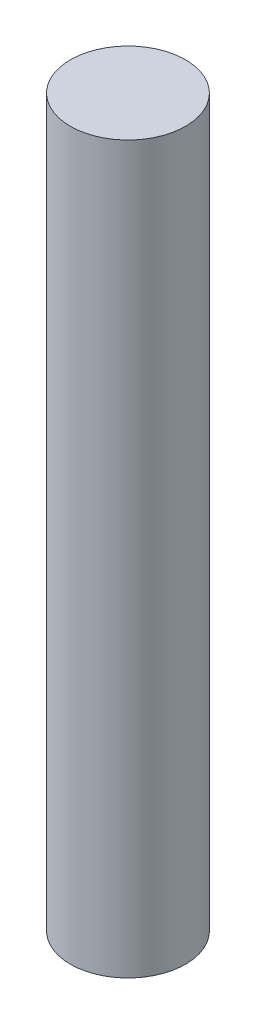
ISO-10303-21;
HEADER;
FILE_DESCRIPTION(('STEP AP214'),'2;1');
FILE_NAME('part.step','',(''),(''),'','','');
FILE_SCHEMA(('AUTOMOTIVE_DESIGN { 1 0 10303 214 1 1 1 1 }'));
ENDSEC;
DATA;
#1=APPLICATION_CONTEXT('core data for automotive mechanical design processes');
#2=APPLICATION_PROTOCOL_DEFINITION('international standard','automotive_design',2000,#1);
#3=PRODUCT_CONTEXT('',#1,'mechanical');
#4=PRODUCT('Part','Part','',(#3));
#5=PRODUCT_RELATED_PRODUCT_CATEGORY('part','',(#4));
#6=PRODUCT_DEFINITION_FORMATION('','',#4);
#7=PRODUCT_DEFINITION_CONTEXT('part definition',#1,'design');
#8=PRODUCT_DEFINITION('design','',#6,#7);
#9=PRODUCT_DEFINITION_SHAPE('','',#8);
#10=(LENGTH_UNIT() NAMED_UNIT(*) SI_UNIT(.MILLI.,.METRE.));
#11=(NAMED_UNIT(*) PLANE_ANGLE_UNIT() SI_UNIT($,.RADIAN.));
#12=(NAMED_UNIT(*) SI_UNIT($,.STERADIAN.) SOLID_ANGLE_UNIT());
#13=UNCERTAINTY_MEASURE_WITH_UNIT(LENGTH_MEASURE(1.E-05),#10,'distance_accuracy_value','');
#14=(GEOMETRIC_REPRESENTATION_CONTEXT(3) GLOBAL_UNCERTAINTY_ASSIGNED_CONTEXT((#13)) GLOBAL_UNIT_ASSIGNED_CONTEXT((#10,
#11,#12)) REPRESENTATION_CONTEXT('',''));
#15=CARTESIAN_POINT('',(0.,0.,0.));
#16=DIRECTION('',(0.,0.,1.));
#17=DIRECTION('',(1.,0.,0.));
#18=AXIS2_PLACEMENT_3D('',#15,#16,#17);
#19=CARTESIAN_POINT('',(0.,60.,0.));
#20=DIRECTION('',(0.,-1.,0.));
#21=DIRECTION('',(0.,0.,-1.));
#22=AXIS2_PLACEMENT_3D('',#19,#20,#21);
#23=CYLINDRICAL_SURFACE('',#22,4.7625);
#24=CARTESIAN_POINT('',(0.,60.,0.));
#25=DIRECTION('',(0.,1.,0.));
#26=DIRECTION('',(0.,0.,1.));
#27=AXIS2_PLACEMENT_3D('',#24,#25,#26);
#28=CIRCLE('',#27,4.7625);
#29=CARTESIAN_POINT('',(0.,60.,4.7625));
#30=VERTEX_POINT('',#29);
#31=EDGE_CURVE('E10',#30,#30,#28,.T.);
#32=ORIENTED_EDGE('',*,*,#31,.F.);
#33=EDGE_LOOP('',(#32));
#34=FACE_BOUND('',#33,.T.);
#35=CARTESIAN_POINT('',(0.,0.,0.));
#36=DIRECTION('',(0.,1.,0.));
#37=DIRECTION('',(0.,0.,1.));
#38=AXIS2_PLACEMENT_3D('',#35,#36,#37);
#39=CIRCLE('',#38,4.7625);
#40=CARTESIAN_POINT('',(0.,0.,4.7625));
#41=VERTEX_POINT('',#40);
#42=EDGE_CURVE('E40',#41,#41,#39,.T.);
#43=ORIENTED_EDGE('',*,*,#42,.T.);
#44=EDGE_LOOP('',(#43));
#45=FACE_BOUND('',#44,.T.);
#46=ADVANCED_FACE('F37',(#34,#45),#23,.T.);
#47=CARTESIAN_POINT('',(0.,60.,0.));
#48=DIRECTION('',(0.,1.,0.));
#49=DIRECTION('',(0.,0.,1.));
#50=AXIS2_PLACEMENT_3D('',#47,#48,#49);
#51=PLANE('',#50);
#52=ORIENTED_EDGE('',*,*,#31,.T.);
#53=EDGE_LOOP('',(#52));
#54=FACE_BOUND('',#53,.T.);
#55=ADVANCED_FACE('F52',(#54),#51,.T.);
#56=CARTESIAN_POINT('',(0.,0.,0.));
#57=DIRECTION('',(0.,1.,0.));
#58=DIRECTION('',(0.,0.,1.));
#59=AXIS2_PLACEMENT_3D('',#56,#57,#58);
#60=PLANE('',#59);
#61=ORIENTED_EDGE('',*,*,#42,.F.);
#62=EDGE_LOOP('',(#61));
#63=FACE_BOUND('',#62,.T.);
#64=ADVANCED_FACE('F50',(#63),#60,.F.);
#65=CLOSED_SHELL('',(#46,#55,#64));
#66=MANIFOLD_SOLID_BREP('B2',#65);
#67=ADVANCED_BREP_SHAPE_REPRESENTATION('',(#18,#66),#14);
#68=SHAPE_DEFINITION_REPRESENTATION(#9,#67);
ENDSEC;
END-ISO-10303-21;
